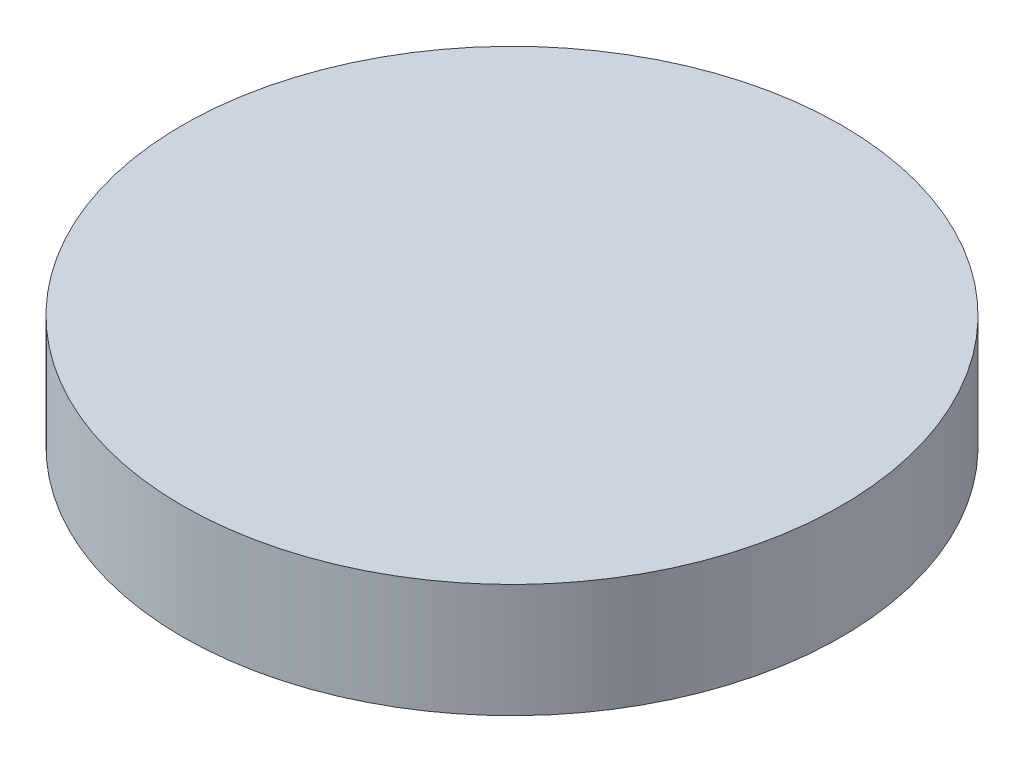
ISO-10303-21;
HEADER;
FILE_DESCRIPTION(('STEP AP214'),'2;1');
FILE_NAME('part.step','',(''),(''),'','','');
FILE_SCHEMA(('AUTOMOTIVE_DESIGN { 1 0 10303 214 1 1 1 1 }'));
ENDSEC;
DATA;
#1=APPLICATION_CONTEXT('core data for automotive mechanical design processes');
#2=APPLICATION_PROTOCOL_DEFINITION('international standard','automotive_design',2000,#1);
#3=PRODUCT_CONTEXT('',#1,'mechanical');
#4=PRODUCT('Part','Part','',(#3));
#5=PRODUCT_RELATED_PRODUCT_CATEGORY('part','',(#4));
#6=PRODUCT_DEFINITION_FORMATION('','',#4);
#7=PRODUCT_DEFINITION_CONTEXT('part definition',#1,'design');
#8=PRODUCT_DEFINITION('design','',#6,#7);
#9=PRODUCT_DEFINITION_SHAPE('','',#8);
#10=(LENGTH_UNIT() NAMED_UNIT(*) SI_UNIT(.MILLI.,.METRE.));
#11=(NAMED_UNIT(*) PLANE_ANGLE_UNIT() SI_UNIT($,.RADIAN.));
#12=(NAMED_UNIT(*) SI_UNIT($,.STERADIAN.) SOLID_ANGLE_UNIT());
#13=UNCERTAINTY_MEASURE_WITH_UNIT(LENGTH_MEASURE(1.E-05),#10,'distance_accuracy_value','');
#14=(GEOMETRIC_REPRESENTATION_CONTEXT(3) GLOBAL_UNCERTAINTY_ASSIGNED_CONTEXT((#13)) GLOBAL_UNIT_ASSIGNED_CONTEXT((#10,
#11,#12)) REPRESENTATION_CONTEXT('',''));
#15=CARTESIAN_POINT('',(0.,0.,0.));
#16=DIRECTION('',(0.,0.,1.));
#17=DIRECTION('',(1.,0.,0.));
#18=AXIS2_PLACEMENT_3D('',#15,#16,#17);
#19=CARTESIAN_POINT('',(0.,12.7,0.));
#20=DIRECTION('',(0.,-1.,0.));
#21=DIRECTION('',(0.,0.,-1.));
#22=AXIS2_PLACEMENT_3D('',#19,#20,#21);
#23=CYLINDRICAL_SURFACE('',#22,36.83);
#24=CARTESIAN_POINT('',(0.,12.7,0.));
#25=DIRECTION('',(0.,1.,0.));
#26=DIRECTION('',(0.,0.,1.));
#27=AXIS2_PLACEMENT_3D('',#24,#25,#26);
#28=CIRCLE('',#27,36.83);
#29=CARTESIAN_POINT('',(0.,12.7,36.83));
#30=VERTEX_POINT('',#29);
#31=EDGE_CURVE('E10',#30,#30,#28,.T.);
#32=ORIENTED_EDGE('',*,*,#31,.F.);
#33=EDGE_LOOP('',(#32));
#34=FACE_BOUND('',#33,.T.);
#35=CARTESIAN_POINT('',(0.,0.,0.));
#36=DIRECTION('',(0.,1.,0.));
#37=DIRECTION('',(0.,0.,1.));
#38=AXIS2_PLACEMENT_3D('',#35,#36,#37);
#39=CIRCLE('',#38,36.83);
#40=CARTESIAN_POINT('',(0.,0.,36.83));
#41=VERTEX_POINT('',#40);
#42=EDGE_CURVE('E38',#41,#41,#39,.T.);
#43=ORIENTED_EDGE('',*,*,#42,.T.);
#44=EDGE_LOOP('',(#43));
#45=FACE_BOUND('',#44,.T.);
#46=ADVANCED_FACE('F35',(#34,#45),#23,.T.);
#47=CARTESIAN_POINT('',(0.,12.7,0.));
#48=DIRECTION('',(0.,1.,0.));
#49=DIRECTION('',(0.,0.,1.));
#50=AXIS2_PLACEMENT_3D('',#47,#48,#49);
#51=PLANE('',#50);
#52=ORIENTED_EDGE('',*,*,#31,.T.);
#53=EDGE_LOOP('',(#52));
#54=FACE_BOUND('',#53,.T.);
#55=ADVANCED_FACE('F50',(#54),#51,.T.);
#56=CARTESIAN_POINT('',(0.,0.,0.));
#57=DIRECTION('',(0.,1.,0.));
#58=DIRECTION('',(0.,0.,1.));
#59=AXIS2_PLACEMENT_3D('',#56,#57,#58);
#60=PLANE('',#59);
#61=ORIENTED_EDGE('',*,*,#42,.F.);
#62=EDGE_LOOP('',(#61));
#63=FACE_BOUND('',#62,.T.);
#64=ADVANCED_FACE('F48',(#63),#60,.F.);
#65=CLOSED_SHELL('',(#46,#55,#64));
#66=MANIFOLD_SOLID_BREP('B2',#65);
#67=ADVANCED_BREP_SHAPE_REPRESENTATION('',(#18,#66),#14);
#68=SHAPE_DEFINITION_REPRESENTATION(#9,#67);
ENDSEC;
END-ISO-10303-21;
